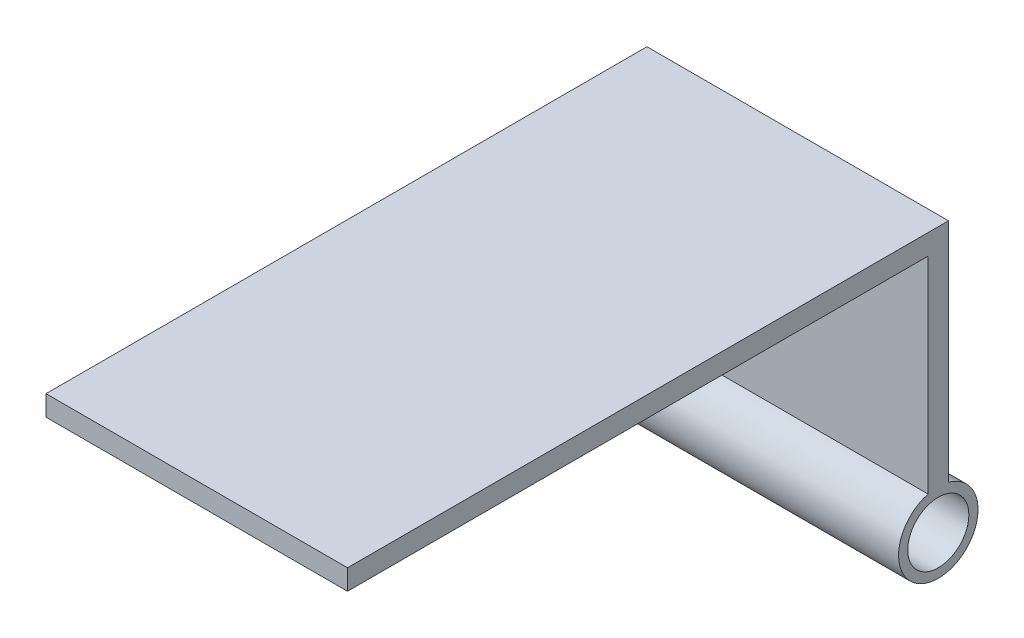
ISO-10303-21;
HEADER;
FILE_DESCRIPTION(('STEP AP214'),'2;1');
FILE_NAME('part.step','',(''),(''),'','','');
FILE_SCHEMA(('AUTOMOTIVE_DESIGN { 1 0 10303 214 1 1 1 1 }'));
ENDSEC;
DATA;
#1=APPLICATION_CONTEXT('core data for automotive mechanical design processes');
#2=APPLICATION_PROTOCOL_DEFINITION('international standard','automotive_design',2000,#1);
#3=PRODUCT_CONTEXT('',#1,'mechanical');
#4=PRODUCT('Part','Part','',(#3));
#5=PRODUCT_RELATED_PRODUCT_CATEGORY('part','',(#4));
#6=PRODUCT_DEFINITION_FORMATION('','',#4);
#7=PRODUCT_DEFINITION_CONTEXT('part definition',#1,'design');
#8=PRODUCT_DEFINITION('design','',#6,#7);
#9=PRODUCT_DEFINITION_SHAPE('','',#8);
#10=(LENGTH_UNIT() NAMED_UNIT(*) SI_UNIT(.MILLI.,.METRE.));
#11=(NAMED_UNIT(*) PLANE_ANGLE_UNIT() SI_UNIT($,.RADIAN.));
#12=(NAMED_UNIT(*) SI_UNIT($,.STERADIAN.) SOLID_ANGLE_UNIT());
#13=UNCERTAINTY_MEASURE_WITH_UNIT(LENGTH_MEASURE(1.E-05),#10,'distance_accuracy_value','');
#14=(GEOMETRIC_REPRESENTATION_CONTEXT(3) GLOBAL_UNCERTAINTY_ASSIGNED_CONTEXT((#13)) GLOBAL_UNIT_ASSIGNED_CONTEXT((#10,
#11,#12)) REPRESENTATION_CONTEXT('',''));
#15=CARTESIAN_POINT('',(0.,0.,0.));
#16=DIRECTION('',(0.,0.,1.));
#17=DIRECTION('',(1.,0.,0.));
#18=AXIS2_PLACEMENT_3D('',#15,#16,#17);
#19=CARTESIAN_POINT('',(0.,12.9969134233995,29.));
#20=DIRECTION('',(0.,1.,0.));
#21=DIRECTION('',(0.,0.,1.));
#22=AXIS2_PLACEMENT_3D('',#19,#20,#21);
#23=PLANE('',#22);
#24=DIRECTION('',(0.,0.,-1.));
#25=VECTOR('',#24,1.);
#26=CARTESIAN_POINT('',(0.,12.9969134233995,0.));
#27=LINE('',#26,#25);
#28=CARTESIAN_POINT('',(0.,12.9969134233995,29.));
#29=VERTEX_POINT('',#28);
#30=CARTESIAN_POINT('',(0.,12.9969134233995,-0.498993341804118));
#31=VERTEX_POINT('',#30);
#32=EDGE_CURVE('E146',#29,#31,#27,.T.);
#33=ORIENTED_EDGE('',*,*,#32,.F.);
#34=DIRECTION('',(1.,0.,0.));
#35=VECTOR('',#34,1.);
#36=CARTESIAN_POINT('',(0.,12.9969134233995,29.));
#37=LINE('',#36,#35);
#38=CARTESIAN_POINT('',(14.8,12.9969134233995,29.));
#39=VERTEX_POINT('',#38);
#40=EDGE_CURVE('E11',#29,#39,#37,.T.);
#41=ORIENTED_EDGE('',*,*,#40,.T.);
#42=DIRECTION('',(0.,0.,-1.));
#43=VECTOR('',#42,1.);
#44=CARTESIAN_POINT('',(14.8,12.9969134233995,0.));
#45=LINE('',#44,#43);
#46=CARTESIAN_POINT('',(14.8,12.9969134233995,-0.498993341804118));
#47=VERTEX_POINT('',#46);
#48=EDGE_CURVE('E50',#39,#47,#45,.T.);
#49=ORIENTED_EDGE('',*,*,#48,.T.);
#50=DIRECTION('',(-1.,0.,0.));
#51=VECTOR('',#50,1.);
#52=CARTESIAN_POINT('',(14.8,12.9969134233995,-0.498993341804118));
#53=LINE('',#52,#51);
#54=EDGE_CURVE('E138',#47,#31,#53,.T.);
#55=ORIENTED_EDGE('',*,*,#54,.T.);
#56=EDGE_LOOP('',(#33,#41,#49,#55));
#57=FACE_BOUND('',#56,.T.);
#58=ADVANCED_FACE('F33',(#57),#23,.T.);
#59=CARTESIAN_POINT('',(14.8,0.,0.50100665819588));
#60=DIRECTION('',(0.,0.,-1.));
#61=DIRECTION('',(0.,1.,0.));
#62=AXIS2_PLACEMENT_3D('',#59,#60,#61);
#63=PLANE('',#62);
#64=DIRECTION('',(1.,0.,0.));
#65=VECTOR('',#64,1.);
#66=CARTESIAN_POINT('',(0.,11.9969134233995,0.501006658195882));
#67=LINE('',#66,#65);
#68=CARTESIAN_POINT('',(0.,11.9969134233995,0.501006658195882));
#69=VERTEX_POINT('',#68);
#70=CARTESIAN_POINT('',(14.8,11.9969134233995,0.501006658195882));
#71=VERTEX_POINT('',#70);
#72=EDGE_CURVE('E85',#69,#71,#67,.T.);
#73=ORIENTED_EDGE('',*,*,#72,.F.);
#74=DIRECTION('',(0.,-1.,0.));
#75=VECTOR('',#74,1.);
#76=CARTESIAN_POINT('',(0.,0.,0.50100665819588));
#77=LINE('',#76,#75);
#78=CARTESIAN_POINT('',(0.,1.88157923576154,0.501006658195881));
#79=VERTEX_POINT('',#78);
#80=EDGE_CURVE('E65',#69,#79,#77,.T.);
#81=ORIENTED_EDGE('',*,*,#80,.T.);
#82=DIRECTION('',(-1.,0.,0.));
#83=VECTOR('',#82,1.);
#84=CARTESIAN_POINT('',(14.8,1.88157923576154,0.501006658195881));
#85=LINE('',#84,#83);
#86=CARTESIAN_POINT('',(14.8,1.88157923576154,0.501006658195881));
#87=VERTEX_POINT('',#86);
#88=EDGE_CURVE('E168',#87,#79,#85,.T.);
#89=ORIENTED_EDGE('',*,*,#88,.F.);
#90=DIRECTION('',(0.,-1.,0.));
#91=VECTOR('',#90,1.);
#92=CARTESIAN_POINT('',(14.8,0.,0.50100665819588));
#93=LINE('',#92,#91);
#94=EDGE_CURVE('E151',#71,#87,#93,.T.);
#95=ORIENTED_EDGE('',*,*,#94,.F.);
#96=EDGE_LOOP('',(#73,#81,#89,#95));
#97=FACE_BOUND('',#96,.T.);
#98=ADVANCED_FACE('F109',(#97),#63,.F.);
#99=CARTESIAN_POINT('',(14.8,-0.0030865766004935,0.00047216816173915));
#100=DIRECTION('',(-1.,0.,0.));
#101=DIRECTION('',(0.,0.,1.));
#102=AXIS2_PLACEMENT_3D('',#99,#100,#101);
#103=CYLINDRICAL_SURFACE('',#102,1.95);
#104=CARTESIAN_POINT('',(0.,-0.0030865766004935,0.00047216816173915));
#105=DIRECTION('',(1.,0.,0.));
#106=DIRECTION('',(0.,0.,-1.));
#107=AXIS2_PLACEMENT_3D('',#104,#105,#106);
#108=CIRCLE('',#107,1.95);
#109=CARTESIAN_POINT('',(0.,1.88186281379558,-0.498993341804119));
#110=VERTEX_POINT('',#109);
#111=EDGE_CURVE('E145',#79,#110,#108,.T.);
#112=ORIENTED_EDGE('',*,*,#111,.T.);
#113=DIRECTION('',(-1.,0.,0.));
#114=VECTOR('',#113,1.);
#115=CARTESIAN_POINT('',(14.8,1.88186281379558,-0.498993341804119));
#116=LINE('',#115,#114);
#117=CARTESIAN_POINT('',(14.8,1.88186281379558,-0.498993341804119));
#118=VERTEX_POINT('',#117);
#119=EDGE_CURVE('E141',#118,#110,#116,.T.);
#120=ORIENTED_EDGE('',*,*,#119,.F.);
#121=CARTESIAN_POINT('',(14.8,-0.0030865766004935,0.00047216816173915));
#122=DIRECTION('',(1.,0.,0.));
#123=DIRECTION('',(0.,0.,-1.));
#124=AXIS2_PLACEMENT_3D('',#121,#122,#123);
#125=CIRCLE('',#124,1.95);
#126=EDGE_CURVE('E160',#87,#118,#125,.T.);
#127=ORIENTED_EDGE('',*,*,#126,.F.);
#128=ORIENTED_EDGE('',*,*,#88,.T.);
#129=EDGE_LOOP('',(#112,#120,#127,#128));
#130=FACE_BOUND('',#129,.T.);
#131=ADVANCED_FACE('F111',(#130),#103,.T.);
#132=CARTESIAN_POINT('',(14.8,0.,-0.498993341804119));
#133=DIRECTION('',(0.,0.,-1.));
#134=DIRECTION('',(0.,1.,0.));
#135=AXIS2_PLACEMENT_3D('',#132,#133,#134);
#136=PLANE('',#135);
#137=DIRECTION('',(0.,-1.,0.));
#138=VECTOR('',#137,1.);
#139=CARTESIAN_POINT('',(0.,0.,-0.498993341804119));
#140=LINE('',#139,#138);
#141=EDGE_CURVE('E134',#31,#110,#140,.T.);
#142=ORIENTED_EDGE('',*,*,#141,.F.);
#143=ORIENTED_EDGE('',*,*,#54,.F.);
#144=DIRECTION('',(0.,-1.,0.));
#145=VECTOR('',#144,1.);
#146=CARTESIAN_POINT('',(14.8,0.,-0.498993341804119));
#147=LINE('',#146,#145);
#148=EDGE_CURVE('E158',#47,#118,#147,.T.);
#149=ORIENTED_EDGE('',*,*,#148,.T.);
#150=ORIENTED_EDGE('',*,*,#119,.T.);
#151=EDGE_LOOP('',(#142,#143,#149,#150));
#152=FACE_BOUND('',#151,.T.);
#153=ADVANCED_FACE('F118',(#152),#136,.T.);
#154=CARTESIAN_POINT('',(14.8,-0.0030865766004935,0.00047216816173915));
#155=DIRECTION('',(-1.,0.,0.));
#156=DIRECTION('',(0.,0.,1.));
#157=AXIS2_PLACEMENT_3D('',#154,#155,#156);
#158=CYLINDRICAL_SURFACE('',#157,1.5);
#159=CARTESIAN_POINT('',(14.8,-0.0030865766004935,0.00047216816173915));
#160=DIRECTION('',(1.,0.,0.));
#161=DIRECTION('',(0.,0.,-1.));
#162=AXIS2_PLACEMENT_3D('',#159,#160,#161);
#163=CIRCLE('',#162,1.5);
#164=CARTESIAN_POINT('',(14.8,-0.0030865766004935,-1.49952783183826));
#165=VERTEX_POINT('',#164);
#166=EDGE_CURVE('E148',#165,#165,#163,.T.);
#167=ORIENTED_EDGE('',*,*,#166,.T.);
#168=EDGE_LOOP('',(#167));
#169=FACE_BOUND('',#168,.T.);
#170=CARTESIAN_POINT('',(0.,-0.0030865766004935,0.00047216816173915));
#171=DIRECTION('',(1.,0.,0.));
#172=DIRECTION('',(0.,0.,-1.));
#173=AXIS2_PLACEMENT_3D('',#170,#171,#172);
#174=CIRCLE('',#173,1.5);
#175=CARTESIAN_POINT('',(0.,-0.0030865766004935,-1.49952783183826));
#176=VERTEX_POINT('',#175);
#177=EDGE_CURVE('E89',#176,#176,#174,.T.);
#178=ORIENTED_EDGE('',*,*,#177,.F.);
#179=EDGE_LOOP('',(#178));
#180=FACE_BOUND('',#179,.T.);
#181=ADVANCED_FACE('F105',(#169,#180),#158,.F.);
#182=CARTESIAN_POINT('',(14.8,0.,0.));
#183=DIRECTION('',(1.,0.,0.));
#184=DIRECTION('',(0.,0.,-1.));
#185=AXIS2_PLACEMENT_3D('',#182,#183,#184);
#186=PLANE('',#185);
#187=ORIENTED_EDGE('',*,*,#166,.F.);
#188=EDGE_LOOP('',(#187));
#189=FACE_BOUND('',#188,.T.);
#190=ORIENTED_EDGE('',*,*,#48,.F.);
#191=DIRECTION('',(0.,1.,0.));
#192=VECTOR('',#191,1.);
#193=CARTESIAN_POINT('',(14.8,11.9969134233995,29.));
#194=LINE('',#193,#192);
#195=CARTESIAN_POINT('',(14.8,11.9969134233995,29.));
#196=VERTEX_POINT('',#195);
#197=EDGE_CURVE('E68',#196,#39,#194,.T.);
#198=ORIENTED_EDGE('',*,*,#197,.F.);
#199=DIRECTION('',(0.,0.,-1.));
#200=VECTOR('',#199,1.);
#201=CARTESIAN_POINT('',(14.8,11.9969134233995,0.));
#202=LINE('',#201,#200);
#203=EDGE_CURVE('E73',#196,#71,#202,.T.);
#204=ORIENTED_EDGE('',*,*,#203,.T.);
#205=ORIENTED_EDGE('',*,*,#94,.T.);
#206=ORIENTED_EDGE('',*,*,#126,.T.);
#207=ORIENTED_EDGE('',*,*,#148,.F.);
#208=EDGE_LOOP('',(#190,#198,#204,#205,#206,#207));
#209=FACE_BOUND('',#208,.T.);
#210=ADVANCED_FACE('F70',(#189,#209),#186,.T.);
#211=CARTESIAN_POINT('',(0.,0.,0.));
#212=DIRECTION('',(1.,0.,0.));
#213=DIRECTION('',(0.,0.,-1.));
#214=AXIS2_PLACEMENT_3D('',#211,#212,#213);
#215=PLANE('',#214);
#216=ORIENTED_EDGE('',*,*,#177,.T.);
#217=EDGE_LOOP('',(#216));
#218=FACE_BOUND('',#217,.T.);
#219=ORIENTED_EDGE('',*,*,#80,.F.);
#220=DIRECTION('',(0.,0.,1.));
#221=VECTOR('',#220,1.);
#222=CARTESIAN_POINT('',(0.,11.9969134233995,0.));
#223=LINE('',#222,#221);
#224=CARTESIAN_POINT('',(0.,11.9969134233995,29.));
#225=VERTEX_POINT('',#224);
#226=EDGE_CURVE('E77',#69,#225,#223,.T.);
#227=ORIENTED_EDGE('',*,*,#226,.T.);
#228=DIRECTION('',(0.,1.,0.));
#229=VECTOR('',#228,1.);
#230=CARTESIAN_POINT('',(0.,11.9969134233995,29.));
#231=LINE('',#230,#229);
#232=EDGE_CURVE('E78',#225,#29,#231,.T.);
#233=ORIENTED_EDGE('',*,*,#232,.T.);
#234=ORIENTED_EDGE('',*,*,#32,.T.);
#235=ORIENTED_EDGE('',*,*,#141,.T.);
#236=ORIENTED_EDGE('',*,*,#111,.F.);
#237=EDGE_LOOP('',(#219,#227,#233,#234,#235,#236));
#238=FACE_BOUND('',#237,.T.);
#239=ADVANCED_FACE('F96',(#218,#238),#215,.F.);
#240=CARTESIAN_POINT('',(0.,11.9969134233995,29.));
#241=DIRECTION('',(0.,0.,1.));
#242=DIRECTION('',(1.,0.,0.));
#243=AXIS2_PLACEMENT_3D('',#240,#241,#242);
#244=PLANE('',#243);
#245=ORIENTED_EDGE('',*,*,#40,.F.);
#246=ORIENTED_EDGE('',*,*,#232,.F.);
#247=DIRECTION('',(1.,0.,0.));
#248=VECTOR('',#247,1.);
#249=CARTESIAN_POINT('',(0.,11.9969134233995,29.));
#250=LINE('',#249,#248);
#251=EDGE_CURVE('E36',#225,#196,#250,.T.);
#252=ORIENTED_EDGE('',*,*,#251,.T.);
#253=ORIENTED_EDGE('',*,*,#197,.T.);
#254=EDGE_LOOP('',(#245,#246,#252,#253));
#255=FACE_BOUND('',#254,.T.);
#256=ADVANCED_FACE('F86',(#255),#244,.T.);
#257=CARTESIAN_POINT('',(0.,11.9969134233995,0.));
#258=DIRECTION('',(0.,1.,0.));
#259=DIRECTION('',(0.,0.,1.));
#260=AXIS2_PLACEMENT_3D('',#257,#258,#259);
#261=PLANE('',#260);
#262=ORIENTED_EDGE('',*,*,#251,.F.);
#263=ORIENTED_EDGE('',*,*,#226,.F.);
#264=ORIENTED_EDGE('',*,*,#72,.T.);
#265=ORIENTED_EDGE('',*,*,#203,.F.);
#266=EDGE_LOOP('',(#262,#263,#264,#265));
#267=FACE_BOUND('',#266,.T.);
#268=ADVANCED_FACE('F83',(#267),#261,.F.);
#269=CLOSED_SHELL('',(#58,#98,#131,#153,#181,#210,#239,#256,#268));
#270=MANIFOLD_SOLID_BREP('B2',#269);
#271=ADVANCED_BREP_SHAPE_REPRESENTATION('',(#18,#270),#14);
#272=SHAPE_DEFINITION_REPRESENTATION(#9,#271);
ENDSEC;
END-ISO-10303-21;
